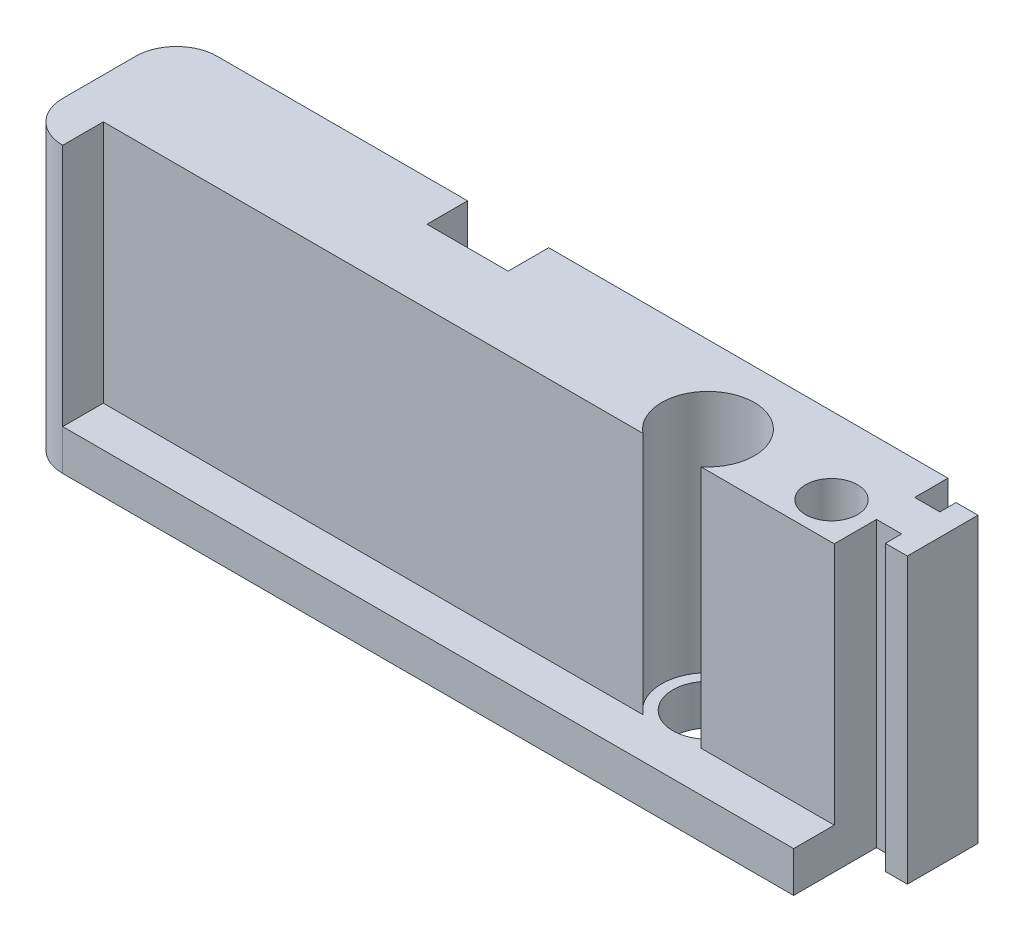
ISO-10303-21;
HEADER;
FILE_DESCRIPTION(('STEP AP214'),'2;1');
FILE_NAME('part.step','',(''),(''),'','','');
FILE_SCHEMA(('AUTOMOTIVE_DESIGN { 1 0 10303 214 1 1 1 1 }'));
ENDSEC;
DATA;
#1=APPLICATION_CONTEXT('core data for automotive mechanical design processes');
#2=APPLICATION_PROTOCOL_DEFINITION('international standard','automotive_design',2000,#1);
#3=PRODUCT_CONTEXT('',#1,'mechanical');
#4=PRODUCT('Part','Part','',(#3));
#5=PRODUCT_RELATED_PRODUCT_CATEGORY('part','',(#4));
#6=PRODUCT_DEFINITION_FORMATION('','',#4);
#7=PRODUCT_DEFINITION_CONTEXT('part definition',#1,'design');
#8=PRODUCT_DEFINITION('design','',#6,#7);
#9=PRODUCT_DEFINITION_SHAPE('','',#8);
#10=(LENGTH_UNIT() NAMED_UNIT(*) SI_UNIT(.MILLI.,.METRE.));
#11=(NAMED_UNIT(*) PLANE_ANGLE_UNIT() SI_UNIT($,.RADIAN.));
#12=(NAMED_UNIT(*) SI_UNIT($,.STERADIAN.) SOLID_ANGLE_UNIT());
#13=UNCERTAINTY_MEASURE_WITH_UNIT(LENGTH_MEASURE(1.E-05),#10,'distance_accuracy_value','');
#14=(GEOMETRIC_REPRESENTATION_CONTEXT(3) GLOBAL_UNCERTAINTY_ASSIGNED_CONTEXT((#13)) GLOBAL_UNIT_ASSIGNED_CONTEXT((#10,
#11,#12)) REPRESENTATION_CONTEXT('',''));
#15=CARTESIAN_POINT('',(0.,0.,0.));
#16=DIRECTION('',(0.,0.,1.));
#17=DIRECTION('',(1.,0.,0.));
#18=AXIS2_PLACEMENT_3D('',#15,#16,#17);
#19=CARTESIAN_POINT('',(-23.55,35.01,-20.));
#20=DIRECTION('',(-1.,0.,0.));
#21=DIRECTION('',(0.,0.,1.));
#22=AXIS2_PLACEMENT_3D('',#19,#20,#21);
#23=PLANE('',#22);
#24=DIRECTION('',(0.,1.,0.));
#25=VECTOR('',#24,1.);
#26=CARTESIAN_POINT('',(-23.55,0.,-34.9));
#27=LINE('',#26,#25);
#28=CARTESIAN_POINT('',(-23.55,0.,-34.9));
#29=VERTEX_POINT('',#28);
#30=CARTESIAN_POINT('',(-23.55,35.,-34.9));
#31=VERTEX_POINT('',#30);
#32=EDGE_CURVE('E405',#29,#31,#27,.T.);
#33=ORIENTED_EDGE('',*,*,#32,.F.);
#34=DIRECTION('',(0.,0.,-1.));
#35=VECTOR('',#34,1.);
#36=CARTESIAN_POINT('',(-23.55,0.,0.));
#37=LINE('',#36,#35);
#38=CARTESIAN_POINT('',(-23.55,0.,-39.));
#39=VERTEX_POINT('',#38);
#40=EDGE_CURVE('E48',#29,#39,#37,.T.);
#41=ORIENTED_EDGE('',*,*,#40,.T.);
#42=DIRECTION('',(0.,1.,0.));
#43=VECTOR('',#42,1.);
#44=CARTESIAN_POINT('',(-23.55,0.,-39.));
#45=LINE('',#44,#43);
#46=CARTESIAN_POINT('',(-23.55,35.,-39.));
#47=VERTEX_POINT('',#46);
#48=EDGE_CURVE('E304',#39,#47,#45,.T.);
#49=ORIENTED_EDGE('',*,*,#48,.T.);
#50=DIRECTION('',(0.,0.,-1.));
#51=VECTOR('',#50,1.);
#52=CARTESIAN_POINT('',(-23.55,35.,0.));
#53=LINE('',#52,#51);
#54=EDGE_CURVE('E307',#31,#47,#53,.T.);
#55=ORIENTED_EDGE('',*,*,#54,.F.);
#56=EDGE_LOOP('',(#33,#41,#49,#55));
#57=FACE_BOUND('',#56,.T.);
#58=ADVANCED_FACE('F39',(#57),#23,.F.);
#59=CARTESIAN_POINT('',(-23.55,0.,-20.));
#60=VERTEX_POINT('',#59);
#61=CARTESIAN_POINT('',(-23.55,0.,-30.2));
#62=VERTEX_POINT('',#61);
#63=EDGE_CURVE('E11',#60,#62,#37,.T.);
#64=ORIENTED_EDGE('',*,*,#63,.T.);
#65=DIRECTION('',(0.,1.,0.));
#66=VECTOR('',#65,1.);
#67=CARTESIAN_POINT('',(-23.55,0.,-30.2));
#68=LINE('',#67,#66);
#69=CARTESIAN_POINT('',(-23.55,35.,-30.2));
#70=VERTEX_POINT('',#69);
#71=EDGE_CURVE('E216',#62,#70,#68,.T.);
#72=ORIENTED_EDGE('',*,*,#71,.T.);
#73=CARTESIAN_POINT('',(-23.55,35.,-25.));
#74=VERTEX_POINT('',#73);
#75=EDGE_CURVE('E43',#74,#70,#53,.T.);
#76=ORIENTED_EDGE('',*,*,#75,.F.);
#77=DIRECTION('',(0.,-1.,0.));
#78=VECTOR('',#77,1.);
#79=CARTESIAN_POINT('',(-23.55,5.,-25.));
#80=LINE('',#79,#78);
#81=CARTESIAN_POINT('',(-23.55,5.,-25.));
#82=VERTEX_POINT('',#81);
#83=EDGE_CURVE('E306',#74,#82,#80,.T.);
#84=ORIENTED_EDGE('',*,*,#83,.T.);
#85=DIRECTION('',(0.,0.,-1.));
#86=VECTOR('',#85,1.);
#87=CARTESIAN_POINT('',(-23.55,5.,-4.5));
#88=LINE('',#87,#86);
#89=CARTESIAN_POINT('',(-23.55,5.,-20.));
#90=VERTEX_POINT('',#89);
#91=EDGE_CURVE('E240',#90,#82,#88,.T.);
#92=ORIENTED_EDGE('',*,*,#91,.F.);
#93=DIRECTION('',(0.,1.,0.));
#94=VECTOR('',#93,1.);
#95=CARTESIAN_POINT('',(-23.55,0.,-20.));
#96=LINE('',#95,#94);
#97=EDGE_CURVE('E237',#60,#90,#96,.T.);
#98=ORIENTED_EDGE('',*,*,#97,.F.);
#99=EDGE_LOOP('',(#64,#72,#76,#84,#92,#98));
#100=FACE_BOUND('',#99,.T.);
#101=ADVANCED_FACE('F41',(#100),#23,.F.);
#102=CARTESIAN_POINT('',(-28.42344593,3.5,-29.5373241));
#103=DIRECTION('',(0.,1.,0.));
#104=DIRECTION('',(0.,0.,1.));
#105=AXIS2_PLACEMENT_3D('',#102,#103,#104);
#106=PLANE('',#105);
#107=CARTESIAN_POINT('',(-28.42344593,3.5,-29.5373241));
#108=DIRECTION('',(0.,1.,0.));
#109=DIRECTION('',(0.,0.,1.));
#110=AXIS2_PLACEMENT_3D('',#107,#108,#109);
#111=CIRCLE('',#110,3.2);
#112=CARTESIAN_POINT('',(-28.42344593,3.5,-26.3373241));
#113=VERTEX_POINT('',#112);
#114=EDGE_CURVE('E402',#113,#113,#111,.T.);
#115=ORIENTED_EDGE('',*,*,#114,.T.);
#116=EDGE_LOOP('',(#115));
#117=FACE_BOUND('',#116,.T.);
#118=CARTESIAN_POINT('',(-28.42344593,3.5,-29.5373241));
#119=DIRECTION('',(0.,1.,0.));
#120=DIRECTION('',(0.,0.,1.));
#121=AXIS2_PLACEMENT_3D('',#118,#119,#120);
#122=CIRCLE('',#121,3.075);
#123=CARTESIAN_POINT('',(-28.42344593,3.5,-26.4623241));
#124=VERTEX_POINT('',#123);
#125=EDGE_CURVE('E299',#124,#124,#122,.F.);
#126=ORIENTED_EDGE('',*,*,#125,.T.);
#127=EDGE_LOOP('',(#126));
#128=FACE_BOUND('',#127,.T.);
#129=ADVANCED_FACE('F522',(#117,#128),#106,.T.);
#130=CARTESIAN_POINT('',(0.,0.,-34.));
#131=DIRECTION('',(0.,0.,-1.));
#132=DIRECTION('',(-1.,0.,0.));
#133=AXIS2_PLACEMENT_3D('',#130,#131,#132);
#134=PLANE('',#133);
#135=DIRECTION('',(1.,0.,0.));
#136=VECTOR('',#135,1.);
#137=CARTESIAN_POINT('',(-87.7041659590242,25.,-34.));
#138=LINE('',#137,#136);
#139=CARTESIAN_POINT('',(-87.7041659590242,25.,-34.));
#140=VERTEX_POINT('',#139);
#141=CARTESIAN_POINT('',(-82.7041659590242,25.,-34.));
#142=VERTEX_POINT('',#141);
#143=EDGE_CURVE('E360',#140,#142,#138,.T.);
#144=ORIENTED_EDGE('',*,*,#143,.T.);
#145=DIRECTION('',(0.,1.,0.));
#146=VECTOR('',#145,1.);
#147=CARTESIAN_POINT('',(-82.7041659590242,35.,-34.));
#148=LINE('',#147,#146);
#149=CARTESIAN_POINT('',(-82.7041659590242,35.,-34.));
#150=VERTEX_POINT('',#149);
#151=EDGE_CURVE('E395',#142,#150,#148,.T.);
#152=ORIENTED_EDGE('',*,*,#151,.T.);
#153=DIRECTION('',(1.,0.,0.));
#154=VECTOR('',#153,1.);
#155=CARTESIAN_POINT('',(-82.7041659590242,35.,-34.));
#156=LINE('',#155,#154);
#157=CARTESIAN_POINT('',(-72.7041659590242,35.,-34.));
#158=VERTEX_POINT('',#157);
#159=EDGE_CURVE('E392',#150,#158,#156,.T.);
#160=ORIENTED_EDGE('',*,*,#159,.T.);
#161=DIRECTION('',(0.,-1.,0.));
#162=VECTOR('',#161,1.);
#163=CARTESIAN_POINT('',(-72.7041659590242,35.,-34.));
#164=LINE('',#163,#162);
#165=CARTESIAN_POINT('',(-72.7041659590242,25.,-34.));
#166=VERTEX_POINT('',#165);
#167=EDGE_CURVE('E389',#158,#166,#164,.T.);
#168=ORIENTED_EDGE('',*,*,#167,.T.);
#169=DIRECTION('',(1.,0.,0.));
#170=VECTOR('',#169,1.);
#171=CARTESIAN_POINT('',(-72.7041659590242,25.,-34.));
#172=LINE('',#171,#170);
#173=CARTESIAN_POINT('',(-67.7041659590242,25.,-34.));
#174=VERTEX_POINT('',#173);
#175=EDGE_CURVE('E386',#166,#174,#172,.T.);
#176=ORIENTED_EDGE('',*,*,#175,.T.);
#177=DIRECTION('',(0.,-1.,0.));
#178=VECTOR('',#177,1.);
#179=CARTESIAN_POINT('',(-67.7041659590242,25.,-34.));
#180=LINE('',#179,#178);
#181=CARTESIAN_POINT('',(-67.7041659590242,20.,-34.));
#182=VERTEX_POINT('',#181);
#183=EDGE_CURVE('E383',#174,#182,#180,.T.);
#184=ORIENTED_EDGE('',*,*,#183,.T.);
#185=DIRECTION('',(-1.,0.,0.));
#186=VECTOR('',#185,1.);
#187=CARTESIAN_POINT('',(-87.7041659590242,20.,-34.));
#188=LINE('',#187,#186);
#189=CARTESIAN_POINT('',(-87.7041659590242,20.,-34.));
#190=VERTEX_POINT('',#189);
#191=EDGE_CURVE('E380',#182,#190,#188,.T.);
#192=ORIENTED_EDGE('',*,*,#191,.T.);
#193=DIRECTION('',(0.,1.,0.));
#194=VECTOR('',#193,1.);
#195=CARTESIAN_POINT('',(-87.7041659590242,25.,-34.));
#196=LINE('',#195,#194);
#197=EDGE_CURVE('E343',#190,#140,#196,.T.);
#198=ORIENTED_EDGE('',*,*,#197,.T.);
#199=EDGE_LOOP('',(#144,#152,#160,#168,#176,#184,#192,#198));
#200=FACE_BOUND('',#199,.T.);
#201=ADVANCED_FACE('F474',(#200),#134,.T.);
#202=CARTESIAN_POINT('',(-28.42344593,3.5,-29.5373241));
#203=DIRECTION('',(0.,1.,0.));
#204=DIRECTION('',(0.,0.,1.));
#205=AXIS2_PLACEMENT_3D('',#202,#203,#204);
#206=CYLINDRICAL_SURFACE('',#205,3.2);
#207=ORIENTED_EDGE('',*,*,#114,.F.);
#208=EDGE_LOOP('',(#207));
#209=FACE_BOUND('',#208,.T.);
#210=CARTESIAN_POINT('',(-28.42344593,35.,-29.5373241));
#211=DIRECTION('',(0.,1.,0.));
#212=DIRECTION('',(0.,0.,1.));
#213=AXIS2_PLACEMENT_3D('',#210,#211,#212);
#214=CIRCLE('',#213,3.2);
#215=CARTESIAN_POINT('',(-28.42344593,35.,-26.3373241));
#216=VERTEX_POINT('',#215);
#217=EDGE_CURVE('E302',#216,#216,#214,.T.);
#218=ORIENTED_EDGE('',*,*,#217,.T.);
#219=EDGE_LOOP('',(#218));
#220=FACE_BOUND('',#219,.T.);
#221=ADVANCED_FACE('F572',(#209,#220),#206,.F.);
#222=CARTESIAN_POINT('',(-72.7041659590242,35.,-34.));
#223=DIRECTION('',(1.,0.,0.));
#224=DIRECTION('',(0.,0.,-1.));
#225=AXIS2_PLACEMENT_3D('',#222,#223,#224);
#226=PLANE('',#225);
#227=DIRECTION('',(0.,-1.,0.));
#228=VECTOR('',#227,1.);
#229=CARTESIAN_POINT('',(-72.7041659590242,35.,-39.));
#230=LINE('',#229,#228);
#231=CARTESIAN_POINT('',(-72.7041659590242,35.,-39.));
#232=VERTEX_POINT('',#231);
#233=CARTESIAN_POINT('',(-72.7041659590242,25.,-39.));
#234=VERTEX_POINT('',#233);
#235=EDGE_CURVE('E370',#232,#234,#230,.T.);
#236=ORIENTED_EDGE('',*,*,#235,.T.);
#237=DIRECTION('',(0.,0.,-1.));
#238=VECTOR('',#237,1.);
#239=CARTESIAN_POINT('',(-72.7041659590242,25.,-34.));
#240=LINE('',#239,#238);
#241=EDGE_CURVE('E348',#166,#234,#240,.T.);
#242=ORIENTED_EDGE('',*,*,#241,.F.);
#243=ORIENTED_EDGE('',*,*,#167,.F.);
#244=DIRECTION('',(0.,0.,-1.));
#245=VECTOR('',#244,1.);
#246=CARTESIAN_POINT('',(-72.7041659590242,35.,-34.));
#247=LINE('',#246,#245);
#248=EDGE_CURVE('E346',#158,#232,#247,.T.);
#249=ORIENTED_EDGE('',*,*,#248,.T.);
#250=EDGE_LOOP('',(#236,#242,#243,#249));
#251=FACE_BOUND('',#250,.T.);
#252=ADVANCED_FACE('F469',(#251),#226,.F.);
#253=CARTESIAN_POINT('',(-72.7041659590242,25.,-34.));
#254=DIRECTION('',(0.,1.,0.));
#255=DIRECTION('',(0.,0.,1.));
#256=AXIS2_PLACEMENT_3D('',#253,#254,#255);
#257=PLANE('',#256);
#258=DIRECTION('',(1.,0.,0.));
#259=VECTOR('',#258,1.);
#260=CARTESIAN_POINT('',(-72.7041659590242,25.,-39.));
#261=LINE('',#260,#259);
#262=CARTESIAN_POINT('',(-67.7041659590242,25.,-39.));
#263=VERTEX_POINT('',#262);
#264=EDGE_CURVE('E367',#234,#263,#261,.T.);
#265=ORIENTED_EDGE('',*,*,#264,.T.);
#266=DIRECTION('',(0.,0.,-1.));
#267=VECTOR('',#266,1.);
#268=CARTESIAN_POINT('',(-67.7041659590242,25.,-34.));
#269=LINE('',#268,#267);
#270=EDGE_CURVE('E350',#174,#263,#269,.T.);
#271=ORIENTED_EDGE('',*,*,#270,.F.);
#272=ORIENTED_EDGE('',*,*,#175,.F.);
#273=ORIENTED_EDGE('',*,*,#241,.T.);
#274=EDGE_LOOP('',(#265,#271,#272,#273));
#275=FACE_BOUND('',#274,.T.);
#276=ADVANCED_FACE('F585',(#275),#257,.F.);
#277=CARTESIAN_POINT('',(-67.7041659590242,25.,-34.));
#278=DIRECTION('',(1.,0.,0.));
#279=DIRECTION('',(0.,0.,-1.));
#280=AXIS2_PLACEMENT_3D('',#277,#278,#279);
#281=PLANE('',#280);
#282=DIRECTION('',(0.,-1.,0.));
#283=VECTOR('',#282,1.);
#284=CARTESIAN_POINT('',(-67.7041659590242,25.,-39.));
#285=LINE('',#284,#283);
#286=CARTESIAN_POINT('',(-67.7041659590242,20.,-39.));
#287=VERTEX_POINT('',#286);
#288=EDGE_CURVE('E364',#263,#287,#285,.T.);
#289=ORIENTED_EDGE('',*,*,#288,.T.);
#290=DIRECTION('',(0.,0.,-1.));
#291=VECTOR('',#290,1.);
#292=CARTESIAN_POINT('',(-67.7041659590242,20.,-34.));
#293=LINE('',#292,#291);
#294=EDGE_CURVE('E352',#182,#287,#293,.T.);
#295=ORIENTED_EDGE('',*,*,#294,.F.);
#296=ORIENTED_EDGE('',*,*,#183,.F.);
#297=ORIENTED_EDGE('',*,*,#270,.T.);
#298=EDGE_LOOP('',(#289,#295,#296,#297));
#299=FACE_BOUND('',#298,.T.);
#300=ADVANCED_FACE('F581',(#299),#281,.F.);
#301=CARTESIAN_POINT('',(-87.7041659590242,20.,-34.));
#302=DIRECTION('',(0.,-1.,0.));
#303=DIRECTION('',(0.,0.,-1.));
#304=AXIS2_PLACEMENT_3D('',#301,#302,#303);
#305=PLANE('',#304);
#306=DIRECTION('',(-1.,0.,0.));
#307=VECTOR('',#306,1.);
#308=CARTESIAN_POINT('',(-87.7041659590242,20.,-39.));
#309=LINE('',#308,#307);
#310=CARTESIAN_POINT('',(-87.7041659590242,20.,-39.));
#311=VERTEX_POINT('',#310);
#312=EDGE_CURVE('E361',#287,#311,#309,.T.);
#313=ORIENTED_EDGE('',*,*,#312,.T.);
#314=DIRECTION('',(0.,0.,-1.));
#315=VECTOR('',#314,1.);
#316=CARTESIAN_POINT('',(-87.7041659590242,20.,-34.));
#317=LINE('',#316,#315);
#318=EDGE_CURVE('E354',#190,#311,#317,.T.);
#319=ORIENTED_EDGE('',*,*,#318,.F.);
#320=ORIENTED_EDGE('',*,*,#191,.F.);
#321=ORIENTED_EDGE('',*,*,#294,.T.);
#322=EDGE_LOOP('',(#313,#319,#320,#321));
#323=FACE_BOUND('',#322,.T.);
#324=ADVANCED_FACE('F577',(#323),#305,.F.);
#325=CARTESIAN_POINT('',(-87.7041659590242,25.,-34.));
#326=DIRECTION('',(-1.,0.,0.));
#327=DIRECTION('',(0.,0.,1.));
#328=AXIS2_PLACEMENT_3D('',#325,#326,#327);
#329=PLANE('',#328);
#330=DIRECTION('',(0.,1.,0.));
#331=VECTOR('',#330,1.);
#332=CARTESIAN_POINT('',(-87.7041659590242,25.,-39.));
#333=LINE('',#332,#331);
#334=CARTESIAN_POINT('',(-87.7041659590242,25.,-39.));
#335=VERTEX_POINT('',#334);
#336=EDGE_CURVE('E357',#311,#335,#333,.T.);
#337=ORIENTED_EDGE('',*,*,#336,.T.);
#338=DIRECTION('',(0.,0.,-1.));
#339=VECTOR('',#338,1.);
#340=CARTESIAN_POINT('',(-87.7041659590242,25.,-34.));
#341=LINE('',#340,#339);
#342=EDGE_CURVE('E338',#140,#335,#341,.T.);
#343=ORIENTED_EDGE('',*,*,#342,.F.);
#344=ORIENTED_EDGE('',*,*,#197,.F.);
#345=ORIENTED_EDGE('',*,*,#318,.T.);
#346=EDGE_LOOP('',(#337,#343,#344,#345));
#347=FACE_BOUND('',#346,.T.);
#348=ADVANCED_FACE('F573',(#347),#329,.F.);
#349=CARTESIAN_POINT('',(-87.7041659590242,25.,-34.));
#350=DIRECTION('',(0.,1.,0.));
#351=DIRECTION('',(0.,0.,1.));
#352=AXIS2_PLACEMENT_3D('',#349,#350,#351);
#353=PLANE('',#352);
#354=DIRECTION('',(1.,0.,0.));
#355=VECTOR('',#354,1.);
#356=CARTESIAN_POINT('',(-87.7041659590242,25.,-39.));
#357=LINE('',#356,#355);
#358=CARTESIAN_POINT('',(-82.7041659590242,25.,-39.));
#359=VERTEX_POINT('',#358);
#360=EDGE_CURVE('E376',#335,#359,#357,.T.);
#361=ORIENTED_EDGE('',*,*,#360,.T.);
#362=DIRECTION('',(0.,0.,-1.));
#363=VECTOR('',#362,1.);
#364=CARTESIAN_POINT('',(-82.7041659590242,25.,-34.));
#365=LINE('',#364,#363);
#366=EDGE_CURVE('E339',#142,#359,#365,.T.);
#367=ORIENTED_EDGE('',*,*,#366,.F.);
#368=ORIENTED_EDGE('',*,*,#143,.F.);
#369=ORIENTED_EDGE('',*,*,#342,.T.);
#370=EDGE_LOOP('',(#361,#367,#368,#369));
#371=FACE_BOUND('',#370,.T.);
#372=ADVANCED_FACE('F576',(#371),#353,.F.);
#373=CARTESIAN_POINT('',(-82.7041659590242,35.,-34.));
#374=DIRECTION('',(-1.,0.,0.));
#375=DIRECTION('',(0.,-1.,0.));
#376=AXIS2_PLACEMENT_3D('',#373,#374,#375);
#377=PLANE('',#376);
#378=DIRECTION('',(0.,1.,0.));
#379=VECTOR('',#378,1.);
#380=CARTESIAN_POINT('',(-82.7041659590242,35.,-39.));
#381=LINE('',#380,#379);
#382=CARTESIAN_POINT('',(-82.7041659590242,35.,-39.));
#383=VERTEX_POINT('',#382);
#384=EDGE_CURVE('E373',#359,#383,#381,.T.);
#385=ORIENTED_EDGE('',*,*,#384,.T.);
#386=DIRECTION('',(0.,0.,-1.));
#387=VECTOR('',#386,1.);
#388=CARTESIAN_POINT('',(-82.7041659590242,35.,-34.));
#389=LINE('',#388,#387);
#390=EDGE_CURVE('E342',#150,#383,#389,.T.);
#391=ORIENTED_EDGE('',*,*,#390,.F.);
#392=ORIENTED_EDGE('',*,*,#151,.F.);
#393=ORIENTED_EDGE('',*,*,#366,.T.);
#394=EDGE_LOOP('',(#385,#391,#392,#393));
#395=FACE_BOUND('',#394,.T.);
#396=ADVANCED_FACE('F478',(#395),#377,.F.);
#397=CARTESIAN_POINT('',(0.,35.,0.));
#398=DIRECTION('',(0.,-1.,0.));
#399=DIRECTION('',(0.,0.,-1.));
#400=AXIS2_PLACEMENT_3D('',#397,#398,#399);
#401=PLANE('',#400);
#402=ORIENTED_EDGE('',*,*,#217,.F.);
#403=EDGE_LOOP('',(#402));
#404=FACE_BOUND('',#403,.T.);
#405=DIRECTION('',(1.,0.,0.));
#406=VECTOR('',#405,1.);
#407=CARTESIAN_POINT('',(-23.55,35.,-25.));
#408=LINE('',#407,#406);
#409=CARTESIAN_POINT('',(-39.9880482878062,35.,-25.));
#410=VERTEX_POINT('',#409);
#411=EDGE_CURVE('E269',#410,#74,#408,.T.);
#412=ORIENTED_EDGE('',*,*,#411,.T.);
#413=ORIENTED_EDGE('',*,*,#75,.T.);
#414=DIRECTION('',(1.,0.,0.));
#415=VECTOR('',#414,1.);
#416=CARTESIAN_POINT('',(-23.55,35.,-30.2));
#417=LINE('',#416,#415);
#418=CARTESIAN_POINT('',(-20.45,35.,-30.2));
#419=VERTEX_POINT('',#418);
#420=EDGE_CURVE('E56',#70,#419,#417,.T.);
#421=ORIENTED_EDGE('',*,*,#420,.T.);
#422=DIRECTION('',(0.,0.,1.));
#423=VECTOR('',#422,1.);
#424=CARTESIAN_POINT('',(-20.45,35.,-30.2));
#425=LINE('',#424,#423);
#426=CARTESIAN_POINT('',(-20.45,35.,-28.2));
#427=VERTEX_POINT('',#426);
#428=EDGE_CURVE('E434',#419,#427,#425,.T.);
#429=ORIENTED_EDGE('',*,*,#428,.T.);
#430=DIRECTION('',(1.,0.,0.));
#431=VECTOR('',#430,1.);
#432=CARTESIAN_POINT('',(-17.75,35.,-28.2));
#433=LINE('',#432,#431);
#434=CARTESIAN_POINT('',(-17.75,35.,-28.2));
#435=VERTEX_POINT('',#434);
#436=EDGE_CURVE('E431',#427,#435,#433,.T.);
#437=ORIENTED_EDGE('',*,*,#436,.T.);
#438=DIRECTION('',(0.,0.,-1.));
#439=VECTOR('',#438,1.);
#440=CARTESIAN_POINT('',(-17.75,35.,-36.9));
#441=LINE('',#440,#439);
#442=CARTESIAN_POINT('',(-17.75,35.,-36.9));
#443=VERTEX_POINT('',#442);
#444=EDGE_CURVE('E428',#435,#443,#441,.T.);
#445=ORIENTED_EDGE('',*,*,#444,.T.);
#446=DIRECTION('',(-1.,0.,0.));
#447=VECTOR('',#446,1.);
#448=CARTESIAN_POINT('',(-20.45,35.,-36.9));
#449=LINE('',#448,#447);
#450=CARTESIAN_POINT('',(-20.45,35.,-36.9));
#451=VERTEX_POINT('',#450);
#452=EDGE_CURVE('E425',#443,#451,#449,.T.);
#453=ORIENTED_EDGE('',*,*,#452,.T.);
#454=DIRECTION('',(0.,0.,1.));
#455=VECTOR('',#454,1.);
#456=CARTESIAN_POINT('',(-20.45,35.,-34.9));
#457=LINE('',#456,#455);
#458=CARTESIAN_POINT('',(-20.45,35.,-34.9));
#459=VERTEX_POINT('',#458);
#460=EDGE_CURVE('E422',#451,#459,#457,.T.);
#461=ORIENTED_EDGE('',*,*,#460,.T.);
#462=DIRECTION('',(-1.,0.,0.));
#463=VECTOR('',#462,1.);
#464=CARTESIAN_POINT('',(-23.55,35.,-34.9));
#465=LINE('',#464,#463);
#466=EDGE_CURVE('E234',#459,#31,#465,.T.);
#467=ORIENTED_EDGE('',*,*,#466,.T.);
#468=ORIENTED_EDGE('',*,*,#54,.T.);
#469=DIRECTION('',(1.,0.,0.));
#470=VECTOR('',#469,1.);
#471=CARTESIAN_POINT('',(-118.55,35.,-39.));
#472=LINE('',#471,#470);
#473=EDGE_CURVE('E328',#232,#47,#472,.T.);
#474=ORIENTED_EDGE('',*,*,#473,.F.);
#475=ORIENTED_EDGE('',*,*,#248,.F.);
#476=ORIENTED_EDGE('',*,*,#159,.F.);
#477=ORIENTED_EDGE('',*,*,#390,.T.);
#478=CARTESIAN_POINT('',(-113.55,35.,-39.));
#479=VERTEX_POINT('',#478);
#480=EDGE_CURVE('E326',#479,#383,#472,.T.);
#481=ORIENTED_EDGE('',*,*,#480,.F.);
#482=CARTESIAN_POINT('',(-113.55,35.,-34.));
#483=DIRECTION('',(0.,-1.,0.));
#484=DIRECTION('',(0.,0.,-1.));
#485=AXIS2_PLACEMENT_3D('',#482,#483,#484);
#486=CIRCLE('',#485,5.);
#487=CARTESIAN_POINT('',(-118.55,35.,-34.));
#488=VERTEX_POINT('',#487);
#489=EDGE_CURVE('E292',#479,#488,#486,.F.);
#490=ORIENTED_EDGE('',*,*,#489,.T.);
#491=DIRECTION('',(0.,0.,-1.));
#492=VECTOR('',#491,1.);
#493=CARTESIAN_POINT('',(-118.55,35.,-25.));
#494=LINE('',#493,#492);
#495=CARTESIAN_POINT('',(-118.55,35.,-25.));
#496=VERTEX_POINT('',#495);
#497=EDGE_CURVE('E262',#496,#488,#494,.T.);
#498=ORIENTED_EDGE('',*,*,#497,.F.);
#499=CARTESIAN_POINT('',(-113.55,35.,-25.));
#500=DIRECTION('',(0.,-1.,0.));
#501=DIRECTION('',(0.,0.,-1.));
#502=AXIS2_PLACEMENT_3D('',#499,#500,#501);
#503=CIRCLE('',#502,5.);
#504=CARTESIAN_POINT('',(-113.55,35.,-20.));
#505=VERTEX_POINT('',#504);
#506=EDGE_CURVE('E294',#496,#505,#503,.F.);
#507=ORIENTED_EDGE('',*,*,#506,.T.);
#508=DIRECTION('',(0.,0.,-1.));
#509=VECTOR('',#508,1.);
#510=CARTESIAN_POINT('',(-113.55,35.,-20.));
#511=LINE('',#510,#509);
#512=CARTESIAN_POINT('',(-113.55,35.,-25.));
#513=VERTEX_POINT('',#512);
#514=EDGE_CURVE('E253',#505,#513,#511,.T.);
#515=ORIENTED_EDGE('',*,*,#514,.T.);
#516=CARTESIAN_POINT('',(-47.1119517121937,35.,-25.));
#517=VERTEX_POINT('',#516);
#518=EDGE_CURVE('E274',#513,#517,#408,.T.);
#519=ORIENTED_EDGE('',*,*,#518,.T.);
#520=CARTESIAN_POINT('',(-43.55,35.,-29.45));
#521=DIRECTION('',(0.,-1.,0.));
#522=DIRECTION('',(0.,0.,-1.));
#523=AXIS2_PLACEMENT_3D('',#520,#521,#522);
#524=CIRCLE('',#523,5.7);
#525=EDGE_CURVE('E280',#517,#410,#524,.T.);
#526=ORIENTED_EDGE('',*,*,#525,.T.);
#527=EDGE_LOOP('',(#412,#413,#421,#429,#437,#445,#453,#461,#467,#468,#474,#475,#476,#477,#481,
#490,#498,#507,#515,#519,#526));
#528=FACE_BOUND('',#527,.T.);
#529=ADVANCED_FACE('F456',(#404,#528),#401,.F.);
#530=CARTESIAN_POINT('',(-28.42344593,35.,-29.5373241));
#531=DIRECTION('',(0.,-1.,0.));
#532=DIRECTION('',(0.,0.,-1.));
#533=AXIS2_PLACEMENT_3D('',#530,#531,#532);
#534=CYLINDRICAL_SURFACE('',#533,3.075);
#535=CARTESIAN_POINT('',(-28.42344593,0.,-29.5373241));
#536=DIRECTION('',(0.,-1.,0.));
#537=DIRECTION('',(0.,0.,-1.));
#538=AXIS2_PLACEMENT_3D('',#535,#536,#537);
#539=CIRCLE('',#538,3.075);
#540=CARTESIAN_POINT('',(-28.42344593,0.,-32.6123241));
#541=VERTEX_POINT('',#540);
#542=EDGE_CURVE('E301',#541,#541,#539,.T.);
#543=ORIENTED_EDGE('',*,*,#542,.T.);
#544=EDGE_LOOP('',(#543));
#545=FACE_BOUND('',#544,.T.);
#546=ORIENTED_EDGE('',*,*,#125,.F.);
#547=EDGE_LOOP('',(#546));
#548=FACE_BOUND('',#547,.T.);
#549=ADVANCED_FACE('F546',(#545,#548),#534,.F.);
#550=CARTESIAN_POINT('',(0.,0.,-39.));
#551=DIRECTION('',(0.,0.,-1.));
#552=DIRECTION('',(-1.,0.,0.));
#553=AXIS2_PLACEMENT_3D('',#550,#551,#552);
#554=PLANE('',#553);
#555=ORIENTED_EDGE('',*,*,#48,.F.);
#556=DIRECTION('',(-1.,0.,0.));
#557=VECTOR('',#556,1.);
#558=CARTESIAN_POINT('',(-118.55,0.,-39.));
#559=LINE('',#558,#557);
#560=CARTESIAN_POINT('',(-113.55,0.,-39.));
#561=VERTEX_POINT('',#560);
#562=EDGE_CURVE('E261',#39,#561,#559,.T.);
#563=ORIENTED_EDGE('',*,*,#562,.T.);
#564=DIRECTION('',(0.,1.,0.));
#565=VECTOR('',#564,1.);
#566=CARTESIAN_POINT('',(-113.55,0.,-39.));
#567=LINE('',#566,#565);
#568=EDGE_CURVE('E296',#561,#479,#567,.T.);
#569=ORIENTED_EDGE('',*,*,#568,.T.);
#570=ORIENTED_EDGE('',*,*,#480,.T.);
#571=ORIENTED_EDGE('',*,*,#384,.F.);
#572=ORIENTED_EDGE('',*,*,#360,.F.);
#573=ORIENTED_EDGE('',*,*,#336,.F.);
#574=ORIENTED_EDGE('',*,*,#312,.F.);
#575=ORIENTED_EDGE('',*,*,#288,.F.);
#576=ORIENTED_EDGE('',*,*,#264,.F.);
#577=ORIENTED_EDGE('',*,*,#235,.F.);
#578=ORIENTED_EDGE('',*,*,#473,.T.);
#579=EDGE_LOOP('',(#555,#563,#569,#570,#571,#572,#573,#574,#575,#576,#577,#578));
#580=FACE_BOUND('',#579,.T.);
#581=ADVANCED_FACE('F465',(#580),#554,.T.);
#582=CARTESIAN_POINT('',(-113.55,0.,-34.));
#583=DIRECTION('',(0.,1.,0.));
#584=DIRECTION('',(0.,0.,1.));
#585=AXIS2_PLACEMENT_3D('',#582,#583,#584);
#586=CYLINDRICAL_SURFACE('',#585,5.);
#587=CARTESIAN_POINT('',(-113.55,0.,-34.));
#588=DIRECTION('',(0.,-1.,0.));
#589=DIRECTION('',(0.,0.,-1.));
#590=AXIS2_PLACEMENT_3D('',#587,#588,#589);
#591=CIRCLE('',#590,5.);
#592=CARTESIAN_POINT('',(-118.55,0.,-34.));
#593=VERTEX_POINT('',#592);
#594=EDGE_CURVE('E283',#593,#561,#591,.T.);
#595=ORIENTED_EDGE('',*,*,#594,.F.);
#596=DIRECTION('',(0.,1.,0.));
#597=VECTOR('',#596,1.);
#598=CARTESIAN_POINT('',(-118.55,0.,-34.));
#599=LINE('',#598,#597);
#600=EDGE_CURVE('E288',#488,#593,#599,.F.);
#601=ORIENTED_EDGE('',*,*,#600,.F.);
#602=ORIENTED_EDGE('',*,*,#489,.F.);
#603=ORIENTED_EDGE('',*,*,#568,.F.);
#604=EDGE_LOOP('',(#595,#601,#602,#603));
#605=FACE_BOUND('',#604,.T.);
#606=ADVANCED_FACE('F492',(#605),#586,.T.);
#607=CARTESIAN_POINT('',(-118.55,0.,0.));
#608=DIRECTION('',(-1.,0.,0.));
#609=DIRECTION('',(0.,0.,1.));
#610=AXIS2_PLACEMENT_3D('',#607,#608,#609);
#611=PLANE('',#610);
#612=DIRECTION('',(0.,0.,1.));
#613=VECTOR('',#612,1.);
#614=CARTESIAN_POINT('',(-118.55,0.,-25.));
#615=LINE('',#614,#613);
#616=CARTESIAN_POINT('',(-118.55,0.,-25.));
#617=VERTEX_POINT('',#616);
#618=EDGE_CURVE('E266',#593,#617,#615,.T.);
#619=ORIENTED_EDGE('',*,*,#618,.T.);
#620=DIRECTION('',(0.,-1.,0.));
#621=VECTOR('',#620,1.);
#622=CARTESIAN_POINT('',(-118.55,0.,-25.));
#623=LINE('',#622,#621);
#624=EDGE_CURVE('E290',#617,#496,#623,.F.);
#625=ORIENTED_EDGE('',*,*,#624,.T.);
#626=ORIENTED_EDGE('',*,*,#497,.T.);
#627=ORIENTED_EDGE('',*,*,#600,.T.);
#628=EDGE_LOOP('',(#619,#625,#626,#627));
#629=FACE_BOUND('',#628,.T.);
#630=ADVANCED_FACE('F488',(#629),#611,.T.);
#631=CARTESIAN_POINT('',(-113.55,35.,-20.));
#632=DIRECTION('',(1.,0.,0.));
#633=DIRECTION('',(0.,0.,-1.));
#634=AXIS2_PLACEMENT_3D('',#631,#632,#633);
#635=PLANE('',#634);
#636=DIRECTION('',(0.,-1.,0.));
#637=VECTOR('',#636,1.);
#638=CARTESIAN_POINT('',(-113.55,35.,-25.));
#639=LINE('',#638,#637);
#640=CARTESIAN_POINT('',(-113.55,5.,-25.));
#641=VERTEX_POINT('',#640);
#642=EDGE_CURVE('E257',#513,#641,#639,.T.);
#643=ORIENTED_EDGE('',*,*,#642,.F.);
#644=ORIENTED_EDGE('',*,*,#514,.F.);
#645=DIRECTION('',(0.,-1.,0.));
#646=VECTOR('',#645,1.);
#647=CARTESIAN_POINT('',(-113.55,35.,-20.));
#648=LINE('',#647,#646);
#649=CARTESIAN_POINT('',(-113.55,5.,-20.));
#650=VERTEX_POINT('',#649);
#651=EDGE_CURVE('E260',#505,#650,#648,.T.);
#652=ORIENTED_EDGE('',*,*,#651,.T.);
#653=DIRECTION('',(0.,0.,-1.));
#654=VECTOR('',#653,1.);
#655=CARTESIAN_POINT('',(-113.55,5.,-20.));
#656=LINE('',#655,#654);
#657=EDGE_CURVE('E250',#650,#641,#656,.T.);
#658=ORIENTED_EDGE('',*,*,#657,.T.);
#659=EDGE_LOOP('',(#643,#644,#652,#658));
#660=FACE_BOUND('',#659,.T.);
#661=ADVANCED_FACE('F499',(#660),#635,.T.);
#662=CARTESIAN_POINT('',(-23.55,5.,-25.));
#663=DIRECTION('',(0.,0.,1.));
#664=DIRECTION('',(1.,0.,0.));
#665=AXIS2_PLACEMENT_3D('',#662,#663,#664);
#666=PLANE('',#665);
#667=DIRECTION('',(1.,0.,0.));
#668=VECTOR('',#667,1.);
#669=CARTESIAN_POINT('',(-23.55,5.,-25.));
#670=LINE('',#669,#668);
#671=CARTESIAN_POINT('',(-47.1119517121937,5.00000000000001,-25.));
#672=VERTEX_POINT('',#671);
#673=EDGE_CURVE('E270',#641,#672,#670,.T.);
#674=ORIENTED_EDGE('',*,*,#673,.T.);
#675=DIRECTION('',(0.,-1.,0.));
#676=VECTOR('',#675,1.);
#677=CARTESIAN_POINT('',(-47.1119517121937,5.00000000000001,-25.));
#678=LINE('',#677,#676);
#679=EDGE_CURVE('E330',#672,#517,#678,.F.);
#680=ORIENTED_EDGE('',*,*,#679,.T.);
#681=ORIENTED_EDGE('',*,*,#518,.F.);
#682=ORIENTED_EDGE('',*,*,#642,.T.);
#683=EDGE_LOOP('',(#674,#680,#681,#682));
#684=FACE_BOUND('',#683,.T.);
#685=ADVANCED_FACE('F502',(#684),#666,.T.);
#686=CARTESIAN_POINT('',(-43.55,5.00000000000001,-29.45));
#687=DIRECTION('',(0.,-1.,0.));
#688=DIRECTION('',(0.,0.,-1.));
#689=AXIS2_PLACEMENT_3D('',#686,#687,#688);
#690=CYLINDRICAL_SURFACE('',#689,5.7);
#691=ORIENTED_EDGE('',*,*,#525,.F.);
#692=ORIENTED_EDGE('',*,*,#679,.F.);
#693=CARTESIAN_POINT('',(-43.55,5.00000000000001,-29.45));
#694=DIRECTION('',(0.,-1.,0.));
#695=DIRECTION('',(0.,0.,-1.));
#696=AXIS2_PLACEMENT_3D('',#693,#694,#695);
#697=CIRCLE('',#696,5.7);
#698=CARTESIAN_POINT('',(-39.9880482878062,5.00000000000001,-25.));
#699=VERTEX_POINT('',#698);
#700=EDGE_CURVE('E320',#672,#699,#697,.T.);
#701=ORIENTED_EDGE('',*,*,#700,.T.);
#702=DIRECTION('',(0.,-1.,0.));
#703=VECTOR('',#702,1.);
#704=CARTESIAN_POINT('',(-39.9880482878062,5.00000000000001,-25.));
#705=LINE('',#704,#703);
#706=EDGE_CURVE('E316',#410,#699,#705,.T.);
#707=ORIENTED_EDGE('',*,*,#706,.F.);
#708=EDGE_LOOP('',(#691,#692,#701,#707));
#709=FACE_BOUND('',#708,.T.);
#710=ADVANCED_FACE('F504',(#709),#690,.F.);
#711=ORIENTED_EDGE('',*,*,#83,.F.);
#712=ORIENTED_EDGE('',*,*,#411,.F.);
#713=ORIENTED_EDGE('',*,*,#706,.T.);
#714=EDGE_CURVE('E273',#699,#82,#670,.T.);
#715=ORIENTED_EDGE('',*,*,#714,.T.);
#716=EDGE_LOOP('',(#711,#712,#713,#715));
#717=FACE_BOUND('',#716,.T.);
#718=ADVANCED_FACE('F315',(#717),#666,.T.);
#719=CARTESIAN_POINT('',(-43.55,35.,-29.5));
#720=DIRECTION('',(0.,-1.,0.));
#721=DIRECTION('',(0.,0.,-1.));
#722=AXIS2_PLACEMENT_3D('',#719,#720,#721);
#723=CYLINDRICAL_SURFACE('',#722,4.37250564869548);
#724=CARTESIAN_POINT('',(-43.55,0.,-29.5));
#725=DIRECTION('',(0.,-1.,0.));
#726=DIRECTION('',(0.,0.,-1.));
#727=AXIS2_PLACEMENT_3D('',#724,#725,#726);
#728=CIRCLE('',#727,4.37250564869548);
#729=CARTESIAN_POINT('',(-43.55,0.,-33.8725056486955));
#730=VERTEX_POINT('',#729);
#731=EDGE_CURVE('E281',#730,#730,#728,.T.);
#732=ORIENTED_EDGE('',*,*,#731,.T.);
#733=EDGE_LOOP('',(#732));
#734=FACE_BOUND('',#733,.T.);
#735=CARTESIAN_POINT('',(-43.55,5.,-29.5));
#736=DIRECTION('',(0.,-1.,0.));
#737=DIRECTION('',(0.,0.,-1.));
#738=AXIS2_PLACEMENT_3D('',#735,#736,#737);
#739=CIRCLE('',#738,4.37250564869548);
#740=CARTESIAN_POINT('',(-43.55,5.,-33.8725056486955));
#741=VERTEX_POINT('',#740);
#742=EDGE_CURVE('E277',#741,#741,#739,.T.);
#743=ORIENTED_EDGE('',*,*,#742,.F.);
#744=EDGE_LOOP('',(#743));
#745=FACE_BOUND('',#744,.T.);
#746=ADVANCED_FACE('F513',(#734,#745),#723,.F.);
#747=CARTESIAN_POINT('',(0.,0.,0.));
#748=DIRECTION('',(0.,-1.,0.));
#749=DIRECTION('',(0.,0.,-1.));
#750=AXIS2_PLACEMENT_3D('',#747,#748,#749);
#751=PLANE('',#750);
#752=ORIENTED_EDGE('',*,*,#63,.F.);
#753=DIRECTION('',(1.,0.,0.));
#754=VECTOR('',#753,1.);
#755=CARTESIAN_POINT('',(-118.55,0.,-20.));
#756=LINE('',#755,#754);
#757=CARTESIAN_POINT('',(-113.55,0.,-20.));
#758=VERTEX_POINT('',#757);
#759=EDGE_CURVE('E244',#758,#60,#756,.T.);
#760=ORIENTED_EDGE('',*,*,#759,.F.);
#761=CARTESIAN_POINT('',(-113.55,0.,-25.));
#762=DIRECTION('',(0.,-1.,0.));
#763=DIRECTION('',(0.,0.,-1.));
#764=AXIS2_PLACEMENT_3D('',#761,#762,#763);
#765=CIRCLE('',#764,5.);
#766=EDGE_CURVE('E286',#758,#617,#765,.T.);
#767=ORIENTED_EDGE('',*,*,#766,.T.);
#768=ORIENTED_EDGE('',*,*,#618,.F.);
#769=ORIENTED_EDGE('',*,*,#594,.T.);
#770=ORIENTED_EDGE('',*,*,#562,.F.);
#771=ORIENTED_EDGE('',*,*,#40,.F.);
#772=DIRECTION('',(-1.,0.,0.));
#773=VECTOR('',#772,1.);
#774=CARTESIAN_POINT('',(-23.55,0.,-34.9));
#775=LINE('',#774,#773);
#776=CARTESIAN_POINT('',(-20.45,0.,-34.9));
#777=VERTEX_POINT('',#776);
#778=EDGE_CURVE('E223',#777,#29,#775,.T.);
#779=ORIENTED_EDGE('',*,*,#778,.F.);
#780=DIRECTION('',(0.,0.,1.));
#781=VECTOR('',#780,1.);
#782=CARTESIAN_POINT('',(-20.45,0.,-34.9));
#783=LINE('',#782,#781);
#784=CARTESIAN_POINT('',(-20.45,0.,-36.9));
#785=VERTEX_POINT('',#784);
#786=EDGE_CURVE('E439',#785,#777,#783,.T.);
#787=ORIENTED_EDGE('',*,*,#786,.F.);
#788=DIRECTION('',(-1.,0.,0.));
#789=VECTOR('',#788,1.);
#790=CARTESIAN_POINT('',(-20.45,0.,-36.9));
#791=LINE('',#790,#789);
#792=CARTESIAN_POINT('',(-17.75,0.,-36.9));
#793=VERTEX_POINT('',#792);
#794=EDGE_CURVE('E442',#793,#785,#791,.T.);
#795=ORIENTED_EDGE('',*,*,#794,.F.);
#796=DIRECTION('',(0.,0.,-1.));
#797=VECTOR('',#796,1.);
#798=CARTESIAN_POINT('',(-17.75,0.,-36.9));
#799=LINE('',#798,#797);
#800=CARTESIAN_POINT('',(-17.75,0.,-28.2));
#801=VERTEX_POINT('',#800);
#802=EDGE_CURVE('E445',#801,#793,#799,.T.);
#803=ORIENTED_EDGE('',*,*,#802,.F.);
#804=DIRECTION('',(1.,0.,0.));
#805=VECTOR('',#804,1.);
#806=CARTESIAN_POINT('',(-17.75,0.,-28.2));
#807=LINE('',#806,#805);
#808=CARTESIAN_POINT('',(-20.45,0.,-28.2));
#809=VERTEX_POINT('',#808);
#810=EDGE_CURVE('E448',#809,#801,#807,.T.);
#811=ORIENTED_EDGE('',*,*,#810,.F.);
#812=DIRECTION('',(0.,0.,1.));
#813=VECTOR('',#812,1.);
#814=CARTESIAN_POINT('',(-20.45,0.,-30.2));
#815=LINE('',#814,#813);
#816=CARTESIAN_POINT('',(-20.45,0.,-30.2));
#817=VERTEX_POINT('',#816);
#818=EDGE_CURVE('E233',#817,#809,#815,.T.);
#819=ORIENTED_EDGE('',*,*,#818,.F.);
#820=DIRECTION('',(1.,0.,0.));
#821=VECTOR('',#820,1.);
#822=CARTESIAN_POINT('',(-23.55,0.,-30.2));
#823=LINE('',#822,#821);
#824=EDGE_CURVE('E219',#62,#817,#823,.T.);
#825=ORIENTED_EDGE('',*,*,#824,.F.);
#826=EDGE_LOOP('',(#752,#760,#767,#768,#769,#770,#771,#779,#787,#795,#803,#811,#819,#825));
#827=FACE_BOUND('',#826,.T.);
#828=ORIENTED_EDGE('',*,*,#542,.F.);
#829=EDGE_LOOP('',(#828));
#830=FACE_BOUND('',#829,.T.);
#831=ORIENTED_EDGE('',*,*,#731,.F.);
#832=EDGE_LOOP('',(#831));
#833=FACE_BOUND('',#832,.T.);
#834=ADVANCED_FACE('F227',(#827,#830,#833),#751,.T.);
#835=CARTESIAN_POINT('',(-113.55,0.,-25.));
#836=DIRECTION('',(0.,-1.,0.));
#837=DIRECTION('',(0.,0.,-1.));
#838=AXIS2_PLACEMENT_3D('',#835,#836,#837);
#839=CYLINDRICAL_SURFACE('',#838,5.);
#840=ORIENTED_EDGE('',*,*,#506,.F.);
#841=ORIENTED_EDGE('',*,*,#624,.F.);
#842=ORIENTED_EDGE('',*,*,#766,.F.);
#843=DIRECTION('',(0.,-1.,0.));
#844=VECTOR('',#843,1.);
#845=CARTESIAN_POINT('',(-113.55,0.,-20.));
#846=LINE('',#845,#844);
#847=EDGE_CURVE('E248',#650,#758,#846,.T.);
#848=ORIENTED_EDGE('',*,*,#847,.F.);
#849=ORIENTED_EDGE('',*,*,#651,.F.);
#850=EDGE_LOOP('',(#840,#841,#842,#848,#849));
#851=FACE_BOUND('',#850,.T.);
#852=ADVANCED_FACE('F494',(#851),#839,.T.);
#853=CARTESIAN_POINT('',(47.5,5.,-4.50000000000001));
#854=DIRECTION('',(0.,-1.,0.));
#855=DIRECTION('',(0.,0.,-1.));
#856=AXIS2_PLACEMENT_3D('',#853,#854,#855);
#857=PLANE('',#856);
#858=ORIENTED_EDGE('',*,*,#742,.T.);
#859=EDGE_LOOP('',(#858));
#860=FACE_BOUND('',#859,.T.);
#861=DIRECTION('',(1.,0.,0.));
#862=VECTOR('',#861,1.);
#863=CARTESIAN_POINT('',(-113.55,5.,-20.));
#864=LINE('',#863,#862);
#865=EDGE_CURVE('E245',#650,#90,#864,.T.);
#866=ORIENTED_EDGE('',*,*,#865,.T.);
#867=ORIENTED_EDGE('',*,*,#91,.T.);
#868=ORIENTED_EDGE('',*,*,#714,.F.);
#869=ORIENTED_EDGE('',*,*,#700,.F.);
#870=ORIENTED_EDGE('',*,*,#673,.F.);
#871=ORIENTED_EDGE('',*,*,#657,.F.);
#872=EDGE_LOOP('',(#866,#867,#868,#869,#870,#871));
#873=FACE_BOUND('',#872,.T.);
#874=ADVANCED_FACE('F319',(#860,#873),#857,.F.);
#875=CARTESIAN_POINT('',(0.,0.,-20.));
#876=DIRECTION('',(0.,0.,1.));
#877=DIRECTION('',(1.,0.,0.));
#878=AXIS2_PLACEMENT_3D('',#875,#876,#877);
#879=PLANE('',#878);
#880=ORIENTED_EDGE('',*,*,#865,.F.);
#881=ORIENTED_EDGE('',*,*,#847,.T.);
#882=ORIENTED_EDGE('',*,*,#759,.T.);
#883=ORIENTED_EDGE('',*,*,#97,.T.);
#884=EDGE_LOOP('',(#880,#881,#882,#883));
#885=FACE_BOUND('',#884,.T.);
#886=ADVANCED_FACE('F247',(#885),#879,.T.);
#887=CARTESIAN_POINT('',(-23.55,0.,-34.9));
#888=DIRECTION('',(0.,0.,-1.));
#889=DIRECTION('',(-1.,0.,0.));
#890=AXIS2_PLACEMENT_3D('',#887,#888,#889);
#891=PLANE('',#890);
#892=ORIENTED_EDGE('',*,*,#466,.F.);
#893=DIRECTION('',(0.,1.,0.));
#894=VECTOR('',#893,1.);
#895=CARTESIAN_POINT('',(-20.45,0.,-34.9));
#896=LINE('',#895,#894);
#897=EDGE_CURVE('E417',#777,#459,#896,.T.);
#898=ORIENTED_EDGE('',*,*,#897,.F.);
#899=ORIENTED_EDGE('',*,*,#778,.T.);
#900=ORIENTED_EDGE('',*,*,#32,.T.);
#901=EDGE_LOOP('',(#892,#898,#899,#900));
#902=FACE_BOUND('',#901,.T.);
#903=ADVANCED_FACE('F529',(#902),#891,.T.);
#904=CARTESIAN_POINT('',(-20.45,0.,-34.9));
#905=DIRECTION('',(-1.,0.,0.));
#906=DIRECTION('',(0.,0.,1.));
#907=AXIS2_PLACEMENT_3D('',#904,#905,#906);
#908=PLANE('',#907);
#909=ORIENTED_EDGE('',*,*,#460,.F.);
#910=DIRECTION('',(0.,1.,0.));
#911=VECTOR('',#910,1.);
#912=CARTESIAN_POINT('',(-20.45,0.,-36.9));
#913=LINE('',#912,#911);
#914=EDGE_CURVE('E415',#785,#451,#913,.T.);
#915=ORIENTED_EDGE('',*,*,#914,.F.);
#916=ORIENTED_EDGE('',*,*,#786,.T.);
#917=ORIENTED_EDGE('',*,*,#897,.T.);
#918=EDGE_LOOP('',(#909,#915,#916,#917));
#919=FACE_BOUND('',#918,.T.);
#920=ADVANCED_FACE('F535',(#919),#908,.T.);
#921=CARTESIAN_POINT('',(-20.45,0.,-36.9));
#922=DIRECTION('',(0.,0.,-1.));
#923=DIRECTION('',(-1.,0.,0.));
#924=AXIS2_PLACEMENT_3D('',#921,#922,#923);
#925=PLANE('',#924);
#926=ORIENTED_EDGE('',*,*,#452,.F.);
#927=DIRECTION('',(0.,1.,0.));
#928=VECTOR('',#927,1.);
#929=CARTESIAN_POINT('',(-17.75,0.,-36.9));
#930=LINE('',#929,#928);
#931=EDGE_CURVE('E413',#793,#443,#930,.T.);
#932=ORIENTED_EDGE('',*,*,#931,.F.);
#933=ORIENTED_EDGE('',*,*,#794,.T.);
#934=ORIENTED_EDGE('',*,*,#914,.T.);
#935=EDGE_LOOP('',(#926,#932,#933,#934));
#936=FACE_BOUND('',#935,.T.);
#937=ADVANCED_FACE('F684',(#936),#925,.T.);
#938=CARTESIAN_POINT('',(-17.75,0.,-36.9));
#939=DIRECTION('',(1.,0.,0.));
#940=DIRECTION('',(0.,0.,-1.));
#941=AXIS2_PLACEMENT_3D('',#938,#939,#940);
#942=PLANE('',#941);
#943=ORIENTED_EDGE('',*,*,#444,.F.);
#944=DIRECTION('',(0.,1.,0.));
#945=VECTOR('',#944,1.);
#946=CARTESIAN_POINT('',(-17.75,0.,-28.2));
#947=LINE('',#946,#945);
#948=EDGE_CURVE('E411',#801,#435,#947,.T.);
#949=ORIENTED_EDGE('',*,*,#948,.F.);
#950=ORIENTED_EDGE('',*,*,#802,.T.);
#951=ORIENTED_EDGE('',*,*,#931,.T.);
#952=EDGE_LOOP('',(#943,#949,#950,#951));
#953=FACE_BOUND('',#952,.T.);
#954=ADVANCED_FACE('F693',(#953),#942,.T.);
#955=CARTESIAN_POINT('',(-17.75,0.,-28.2));
#956=DIRECTION('',(0.,0.,1.));
#957=DIRECTION('',(1.,0.,0.));
#958=AXIS2_PLACEMENT_3D('',#955,#956,#957);
#959=PLANE('',#958);
#960=ORIENTED_EDGE('',*,*,#436,.F.);
#961=DIRECTION('',(0.,1.,0.));
#962=VECTOR('',#961,1.);
#963=CARTESIAN_POINT('',(-20.45,0.,-28.2));
#964=LINE('',#963,#962);
#965=EDGE_CURVE('E409',#809,#427,#964,.T.);
#966=ORIENTED_EDGE('',*,*,#965,.F.);
#967=ORIENTED_EDGE('',*,*,#810,.T.);
#968=ORIENTED_EDGE('',*,*,#948,.T.);
#969=EDGE_LOOP('',(#960,#966,#967,#968));
#970=FACE_BOUND('',#969,.T.);
#971=ADVANCED_FACE('F702',(#970),#959,.T.);
#972=CARTESIAN_POINT('',(-20.45,0.,-30.2));
#973=DIRECTION('',(-1.,0.,0.));
#974=DIRECTION('',(0.,0.,1.));
#975=AXIS2_PLACEMENT_3D('',#972,#973,#974);
#976=PLANE('',#975);
#977=ORIENTED_EDGE('',*,*,#428,.F.);
#978=DIRECTION('',(0.,1.,0.));
#979=VECTOR('',#978,1.);
#980=CARTESIAN_POINT('',(-20.45,0.,-30.2));
#981=LINE('',#980,#979);
#982=EDGE_CURVE('E222',#817,#419,#981,.T.);
#983=ORIENTED_EDGE('',*,*,#982,.F.);
#984=ORIENTED_EDGE('',*,*,#818,.T.);
#985=ORIENTED_EDGE('',*,*,#965,.T.);
#986=EDGE_LOOP('',(#977,#983,#984,#985));
#987=FACE_BOUND('',#986,.T.);
#988=ADVANCED_FACE('F453',(#987),#976,.T.);
#989=CARTESIAN_POINT('',(-23.55,0.,-30.2));
#990=DIRECTION('',(0.,0.,1.));
#991=DIRECTION('',(1.,0.,0.));
#992=AXIS2_PLACEMENT_3D('',#989,#990,#991);
#993=PLANE('',#992);
#994=ORIENTED_EDGE('',*,*,#420,.F.);
#995=ORIENTED_EDGE('',*,*,#71,.F.);
#996=ORIENTED_EDGE('',*,*,#824,.T.);
#997=ORIENTED_EDGE('',*,*,#982,.T.);
#998=EDGE_LOOP('',(#994,#995,#996,#997));
#999=FACE_BOUND('',#998,.T.);
#1000=ADVANCED_FACE('F218',(#999),#993,.T.);
#1001=CLOSED_SHELL('',(#58,#101,#129,#201,#221,#252,#276,#300,#324,#348,#372,#396,#529,#549,
#581,#606,#630,#661,#685,#710,#718,#746,#834,#852,#874,#886,#903,#920,#937,#954,#971,#988,#1000));
#1002=MANIFOLD_SOLID_BREP('B2',#1001);
#1003=ADVANCED_BREP_SHAPE_REPRESENTATION('',(#18,#1002),#14);
#1004=SHAPE_DEFINITION_REPRESENTATION(#9,#1003);
ENDSEC;
END-ISO-10303-21;
